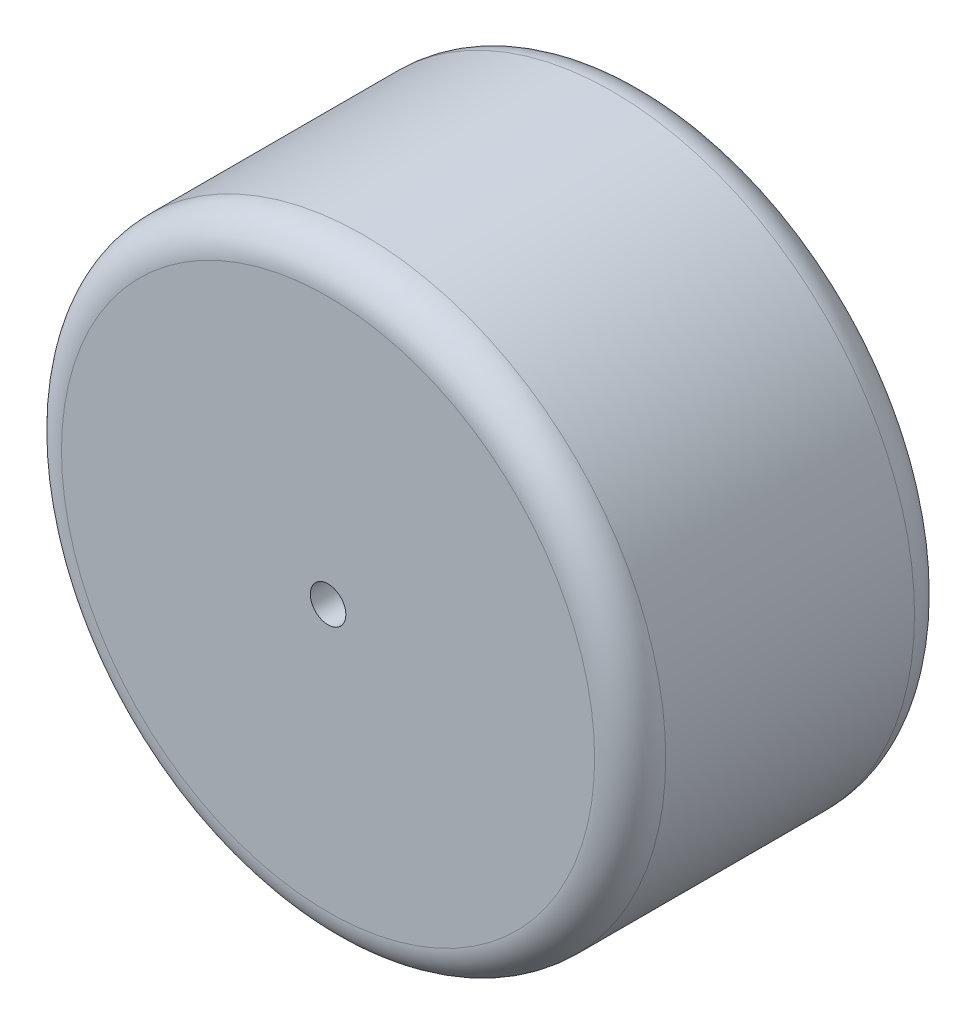
ISO-10303-21;
HEADER;
FILE_DESCRIPTION(('STEP AP214'),'2;1');
FILE_NAME('part.step','',(''),(''),'','','');
FILE_SCHEMA(('AUTOMOTIVE_DESIGN { 1 0 10303 214 1 1 1 1 }'));
ENDSEC;
DATA;
#1=APPLICATION_CONTEXT('core data for automotive mechanical design processes');
#2=APPLICATION_PROTOCOL_DEFINITION('international standard','automotive_design',2000,#1);
#3=PRODUCT_CONTEXT('',#1,'mechanical');
#4=PRODUCT('Part','Part','',(#3));
#5=PRODUCT_RELATED_PRODUCT_CATEGORY('part','',(#4));
#6=PRODUCT_DEFINITION_FORMATION('','',#4);
#7=PRODUCT_DEFINITION_CONTEXT('part definition',#1,'design');
#8=PRODUCT_DEFINITION('design','',#6,#7);
#9=PRODUCT_DEFINITION_SHAPE('','',#8);
#10=(LENGTH_UNIT() NAMED_UNIT(*) SI_UNIT(.MILLI.,.METRE.));
#11=(NAMED_UNIT(*) PLANE_ANGLE_UNIT() SI_UNIT($,.RADIAN.));
#12=(NAMED_UNIT(*) SI_UNIT($,.STERADIAN.) SOLID_ANGLE_UNIT());
#13=UNCERTAINTY_MEASURE_WITH_UNIT(LENGTH_MEASURE(1.E-05),#10,'distance_accuracy_value','');
#14=(GEOMETRIC_REPRESENTATION_CONTEXT(3) GLOBAL_UNCERTAINTY_ASSIGNED_CONTEXT((#13)) GLOBAL_UNIT_ASSIGNED_CONTEXT((#10,
#11,#12)) REPRESENTATION_CONTEXT('',''));
#15=CARTESIAN_POINT('',(0.,0.,0.));
#16=DIRECTION('',(0.,0.,1.));
#17=DIRECTION('',(1.,0.,0.));
#18=AXIS2_PLACEMENT_3D('',#15,#16,#17);
#19=CARTESIAN_POINT('',(0.,0.,18.));
#20=DIRECTION('',(0.,0.,1.));
#21=DIRECTION('',(1.,0.,0.));
#22=AXIS2_PLACEMENT_3D('',#19,#20,#21);
#23=PLANE('',#22);
#24=CARTESIAN_POINT('',(0.,0.,18.));
#25=DIRECTION('',(0.,0.,1.));
#26=DIRECTION('',(1.,0.,0.));
#27=AXIS2_PLACEMENT_3D('',#24,#25,#26);
#28=CIRCLE('',#27,15.);
#29=CARTESIAN_POINT('',(15.,0.,18.));
#30=VERTEX_POINT('',#29);
#31=EDGE_CURVE('E54',#30,#30,#28,.T.);
#32=ORIENTED_EDGE('',*,*,#31,.T.);
#33=EDGE_LOOP('',(#32));
#34=FACE_BOUND('',#33,.T.);
#35=CARTESIAN_POINT('',(0.,0.,18.));
#36=DIRECTION('',(0.,0.,1.));
#37=DIRECTION('',(1.,0.,0.));
#38=AXIS2_PLACEMENT_3D('',#35,#36,#37);
#39=CIRCLE('',#38,1.);
#40=CARTESIAN_POINT('',(1.,0.,18.));
#41=VERTEX_POINT('',#40);
#42=EDGE_CURVE('E59',#41,#41,#39,.T.);
#43=ORIENTED_EDGE('',*,*,#42,.F.);
#44=EDGE_LOOP('',(#43));
#45=FACE_BOUND('',#44,.T.);
#46=ADVANCED_FACE('F39',(#34,#45),#23,.T.);
#47=CARTESIAN_POINT('',(0.,0.,0.));
#48=DIRECTION('',(0.,0.,1.));
#49=DIRECTION('',(1.,0.,0.));
#50=AXIS2_PLACEMENT_3D('',#47,#48,#49);
#51=PLANE('',#50);
#52=CARTESIAN_POINT('',(0.,0.,0.));
#53=DIRECTION('',(0.,0.,1.));
#54=DIRECTION('',(1.,0.,0.));
#55=AXIS2_PLACEMENT_3D('',#52,#53,#54);
#56=CIRCLE('',#55,15.);
#57=CARTESIAN_POINT('',(15.,0.,0.));
#58=VERTEX_POINT('',#57);
#59=EDGE_CURVE('E10',#58,#58,#56,.F.);
#60=ORIENTED_EDGE('',*,*,#59,.T.);
#61=EDGE_LOOP('',(#60));
#62=FACE_BOUND('',#61,.T.);
#63=CARTESIAN_POINT('',(0.,0.,0.));
#64=DIRECTION('',(0.,0.,1.));
#65=DIRECTION('',(1.,0.,0.));
#66=AXIS2_PLACEMENT_3D('',#63,#64,#65);
#67=CIRCLE('',#66,1.);
#68=CARTESIAN_POINT('',(1.,0.,0.));
#69=VERTEX_POINT('',#68);
#70=EDGE_CURVE('E60',#69,#69,#67,.T.);
#71=ORIENTED_EDGE('',*,*,#70,.T.);
#72=EDGE_LOOP('',(#71));
#73=FACE_BOUND('',#72,.T.);
#74=ADVANCED_FACE('F70',(#62,#73),#51,.F.);
#75=CARTESIAN_POINT('',(0.,0.,18.));
#76=DIRECTION('',(0.,0.,-1.));
#77=DIRECTION('',(-1.,0.,0.));
#78=AXIS2_PLACEMENT_3D('',#75,#76,#77);
#79=CYLINDRICAL_SURFACE('',#78,17.);
#80=CARTESIAN_POINT('',(0.,0.,16.));
#81=DIRECTION('',(0.,0.,1.));
#82=DIRECTION('',(1.,0.,0.));
#83=AXIS2_PLACEMENT_3D('',#80,#81,#82);
#84=CIRCLE('',#83,17.);
#85=CARTESIAN_POINT('',(17.,0.,16.));
#86=VERTEX_POINT('',#85);
#87=EDGE_CURVE('E46',#86,#86,#84,.F.);
#88=ORIENTED_EDGE('',*,*,#87,.T.);
#89=EDGE_LOOP('',(#88));
#90=FACE_BOUND('',#89,.T.);
#91=CARTESIAN_POINT('',(0.,0.,2.));
#92=DIRECTION('',(0.,0.,1.));
#93=DIRECTION('',(1.,0.,0.));
#94=AXIS2_PLACEMENT_3D('',#91,#92,#93);
#95=CIRCLE('',#94,17.);
#96=CARTESIAN_POINT('',(17.,0.,2.));
#97=VERTEX_POINT('',#96);
#98=EDGE_CURVE('E50',#97,#97,#95,.T.);
#99=ORIENTED_EDGE('',*,*,#98,.T.);
#100=EDGE_LOOP('',(#99));
#101=FACE_BOUND('',#100,.T.);
#102=ADVANCED_FACE('F77',(#90,#101),#79,.T.);
#103=CARTESIAN_POINT('',(0.,0.,18.));
#104=DIRECTION('',(0.,0.,-1.));
#105=DIRECTION('',(-1.,0.,0.));
#106=AXIS2_PLACEMENT_3D('',#103,#104,#105);
#107=CYLINDRICAL_SURFACE('',#106,1.);
#108=ORIENTED_EDGE('',*,*,#42,.T.);
#109=EDGE_LOOP('',(#108));
#110=FACE_BOUND('',#109,.T.);
#111=ORIENTED_EDGE('',*,*,#70,.F.);
#112=EDGE_LOOP('',(#111));
#113=FACE_BOUND('',#112,.T.);
#114=ADVANCED_FACE('F66',(#110,#113),#107,.F.);
#115=CARTESIAN_POINT('',(0.,0.,16.));
#116=DIRECTION('',(0.,0.,1.));
#117=DIRECTION('',(1.,0.,0.));
#118=AXIS2_PLACEMENT_3D('',#115,#116,#117);
#119=TOROIDAL_SURFACE('',#118,15.,2.);
#120=ORIENTED_EDGE('',*,*,#87,.F.);
#121=EDGE_LOOP('',(#120));
#122=FACE_BOUND('',#121,.T.);
#123=ORIENTED_EDGE('',*,*,#31,.F.);
#124=EDGE_LOOP('',(#123));
#125=FACE_BOUND('',#124,.T.);
#126=ADVANCED_FACE('F82',(#122,#125),#119,.T.);
#127=CARTESIAN_POINT('',(0.,0.,2.));
#128=DIRECTION('',(0.,0.,1.));
#129=DIRECTION('',(1.,0.,0.));
#130=AXIS2_PLACEMENT_3D('',#127,#128,#129);
#131=TOROIDAL_SURFACE('',#130,15.,2.);
#132=ORIENTED_EDGE('',*,*,#59,.F.);
#133=EDGE_LOOP('',(#132));
#134=FACE_BOUND('',#133,.T.);
#135=ORIENTED_EDGE('',*,*,#98,.F.);
#136=EDGE_LOOP('',(#135));
#137=FACE_BOUND('',#136,.T.);
#138=ADVANCED_FACE('F41',(#134,#137),#131,.T.);
#139=CLOSED_SHELL('',(#46,#74,#102,#114,#126,#138));
#140=MANIFOLD_SOLID_BREP('B2',#139);
#141=ADVANCED_BREP_SHAPE_REPRESENTATION('',(#18,#140),#14);
#142=SHAPE_DEFINITION_REPRESENTATION(#9,#141);
ENDSEC;
END-ISO-10303-21;
